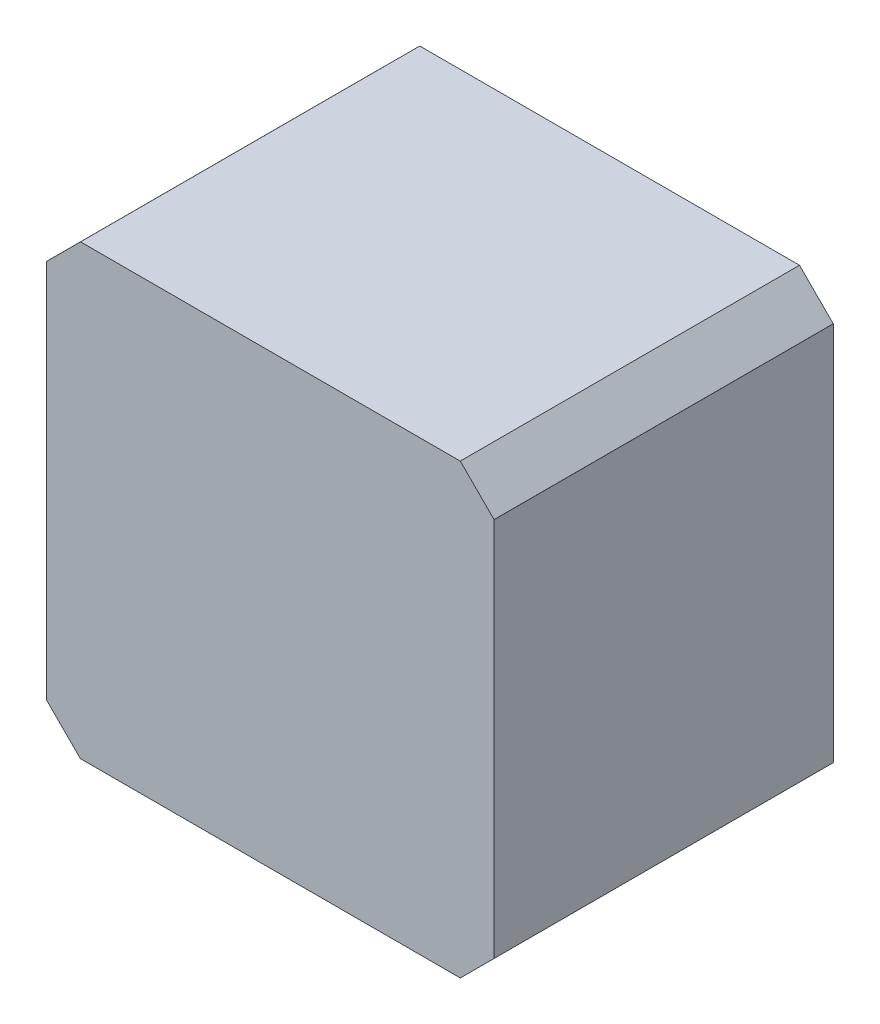
ISO-10303-21;
HEADER;
FILE_DESCRIPTION(('STEP AP214'),'2;1');
FILE_NAME('part.step','',(''),(''),'','','');
FILE_SCHEMA(('AUTOMOTIVE_DESIGN { 1 0 10303 214 1 1 1 1 }'));
ENDSEC;
DATA;
#1=APPLICATION_CONTEXT('core data for automotive mechanical design processes');
#2=APPLICATION_PROTOCOL_DEFINITION('international standard','automotive_design',2000,#1);
#3=PRODUCT_CONTEXT('',#1,'mechanical');
#4=PRODUCT('Part','Part','',(#3));
#5=PRODUCT_RELATED_PRODUCT_CATEGORY('part','',(#4));
#6=PRODUCT_DEFINITION_FORMATION('','',#4);
#7=PRODUCT_DEFINITION_CONTEXT('part definition',#1,'design');
#8=PRODUCT_DEFINITION('design','',#6,#7);
#9=PRODUCT_DEFINITION_SHAPE('','',#8);
#10=(LENGTH_UNIT() NAMED_UNIT(*) SI_UNIT(.MILLI.,.METRE.));
#11=(NAMED_UNIT(*) PLANE_ANGLE_UNIT() SI_UNIT($,.RADIAN.));
#12=(NAMED_UNIT(*) SI_UNIT($,.STERADIAN.) SOLID_ANGLE_UNIT());
#13=UNCERTAINTY_MEASURE_WITH_UNIT(LENGTH_MEASURE(1.E-05),#10,'distance_accuracy_value','');
#14=(GEOMETRIC_REPRESENTATION_CONTEXT(3) GLOBAL_UNCERTAINTY_ASSIGNED_CONTEXT((#13)) GLOBAL_UNIT_ASSIGNED_CONTEXT((#10,
#11,#12)) REPRESENTATION_CONTEXT('',''));
#15=CARTESIAN_POINT('',(0.,0.,0.));
#16=DIRECTION('',(0.,0.,1.));
#17=DIRECTION('',(1.,0.,0.));
#18=AXIS2_PLACEMENT_3D('',#15,#16,#17);
#19=CARTESIAN_POINT('',(21.94100454082,20.29168773,5.00000016));
#20=DIRECTION('',(0.,0.,1.));
#21=DIRECTION('',(1.,0.,0.));
#22=AXIS2_PLACEMENT_3D('',#19,#20,#21);
#23=PLANE('',#22);
#24=DIRECTION('',(-0.707106781186548,-0.707106781186548,0.));
#25=VECTOR('',#24,1.);
#26=CARTESIAN_POINT('',(21.94100454082,20.29168773,5.00000016));
#27=LINE('',#26,#25);
#28=CARTESIAN_POINT('',(21.94100454082,20.29168773,5.00000016));
#29=VERTEX_POINT('',#28);
#30=CARTESIAN_POINT('',(21.44296134082,19.79364453,5.00000016));
#31=VERTEX_POINT('',#30);
#32=EDGE_CURVE('E146',#29,#31,#27,.T.);
#33=ORIENTED_EDGE('',*,*,#32,.T.);
#34=DIRECTION('',(-0.999996307912623,0.00271738129860098,0.));
#35=VECTOR('',#34,1.);
#36=CARTESIAN_POINT('',(21.44296134082,19.79364453,5.00000016));
#37=LINE('',#36,#35);
#38=CARTESIAN_POINT('',(21.44202662082,19.79364707,5.00000016));
#39=VERTEX_POINT('',#38);
#40=EDGE_CURVE('E141',#31,#39,#37,.T.);
#41=ORIENTED_EDGE('',*,*,#40,.T.);
#42=DIRECTION('',(4.53280189256953E-07,-0.999999999999897,0.));
#43=VECTOR('',#42,1.);
#44=CARTESIAN_POINT('',(21.44202662082,19.79364707,5.00000016));
#45=LINE('',#44,#43);
#46=CARTESIAN_POINT('',(21.44202916082,14.19004893,5.00000016));
#47=VERTEX_POINT('',#46);
#48=EDGE_CURVE('E193',#39,#47,#45,.T.);
#49=ORIENTED_EDGE('',*,*,#48,.T.);
#50=DIRECTION('',(0.70710858750274,-0.70710497486574,0.));
#51=VECTOR('',#50,1.);
#52=CARTESIAN_POINT('',(21.44202916082,14.19004893,5.00000016));
#53=LINE('',#52,#51);
#54=CARTESIAN_POINT('',(21.93918844082,13.69289219,5.00000016));
#55=VERTEX_POINT('',#54);
#56=EDGE_CURVE('E164',#47,#55,#53,.T.);
#57=ORIENTED_EDGE('',*,*,#56,.T.);
#58=DIRECTION('',(0.713228571161718,0.700931526811723,0.));
#59=VECTOR('',#58,1.);
#60=CARTESIAN_POINT('',(21.93918844082,13.69289219,5.00000016));
#61=LINE('',#60,#59);
#62=CARTESIAN_POINT('',(21.93977772082,13.69347131,5.00000016));
#63=VERTEX_POINT('',#62);
#64=EDGE_CURVE('E223',#55,#63,#61,.T.);
#65=ORIENTED_EDGE('',*,*,#64,.T.);
#66=DIRECTION('',(0.999999999999897,4.53611216003853E-07,0.));
#67=VECTOR('',#66,1.);
#68=CARTESIAN_POINT('',(21.93977772082,13.69347131,5.00000016));
#69=LINE('',#68,#67);
#70=CARTESIAN_POINT('',(27.53928646082,13.69347385,5.00000016));
#71=VERTEX_POINT('',#70);
#72=EDGE_CURVE('E169',#63,#71,#69,.T.);
#73=ORIENTED_EDGE('',*,*,#72,.T.);
#74=DIRECTION('',(0.707103175090353,0.707110387264353,0.));
#75=VECTOR('',#74,1.);
#76=CARTESIAN_POINT('',(27.53928646082,13.69347385,5.00000016));
#77=LINE('',#76,#75);
#78=CARTESIAN_POINT('',(28.03734490082,14.19153737,5.00000016));
#79=VERTEX_POINT('',#78);
#80=EDGE_CURVE('E175',#71,#79,#77,.T.);
#81=ORIENTED_EDGE('',*,*,#80,.T.);
#82=DIRECTION('',(0.,1.,0.));
#83=VECTOR('',#82,1.);
#84=CARTESIAN_POINT('',(28.03734490082,14.19153737,5.00000016));
#85=LINE('',#84,#83);
#86=CARTESIAN_POINT('',(28.03734490082,19.79365469,5.00000016));
#87=VERTEX_POINT('',#86);
#88=EDGE_CURVE('E245',#79,#87,#85,.T.);
#89=ORIENTED_EDGE('',*,*,#88,.T.);
#90=DIRECTION('',(-1.,0.,0.));
#91=VECTOR('',#90,1.);
#92=CARTESIAN_POINT('',(28.03734490082,19.79365469,5.00000016));
#93=LINE('',#92,#91);
#94=CARTESIAN_POINT('',(28.03641018082,19.79365469,5.00000016));
#95=VERTEX_POINT('',#94);
#96=EDGE_CURVE('E189',#87,#95,#93,.T.);
#97=ORIENTED_EDGE('',*,*,#96,.T.);
#98=DIRECTION('',(-0.707106781186548,0.707106781186548,0.));
#99=VECTOR('',#98,1.);
#100=CARTESIAN_POINT('',(28.03641018082,19.79365469,5.00000016));
#101=LINE('',#100,#99);
#102=CARTESIAN_POINT('',(27.53836698082,20.29169789,5.00000016));
#103=VERTEX_POINT('',#102);
#104=EDGE_CURVE('E20',#95,#103,#101,.T.);
#105=ORIENTED_EDGE('',*,*,#104,.T.);
#106=DIRECTION('',(-0.999999999998353,-1.81514063041164E-06,0.));
#107=VECTOR('',#106,1.);
#108=CARTESIAN_POINT('',(27.53836698082,20.29169789,5.00000016));
#109=LINE('',#108,#107);
#110=EDGE_CURVE('E11',#103,#29,#109,.T.);
#111=ORIENTED_EDGE('',*,*,#110,.T.);
#112=EDGE_LOOP('',(#33,#41,#49,#57,#65,#73,#81,#89,#97,#105,#111));
#113=FACE_BOUND('',#112,.T.);
#114=ADVANCED_FACE('F16',(#113),#23,.T.);
#115=CARTESIAN_POINT('',(21.94100454082,20.29168773,0.));
#116=DIRECTION('',(0.,0.,1.));
#117=DIRECTION('',(1.,0.,0.));
#118=AXIS2_PLACEMENT_3D('',#115,#116,#117);
#119=PLANE('',#118);
#120=DIRECTION('',(-0.999999999998353,-1.81514063041164E-06,0.));
#121=VECTOR('',#120,1.);
#122=CARTESIAN_POINT('',(27.53836698082,20.29169789,0.));
#123=LINE('',#122,#121);
#124=CARTESIAN_POINT('',(27.53836698082,20.29169789,0.));
#125=VERTEX_POINT('',#124);
#126=CARTESIAN_POINT('',(21.94100454082,20.29168773,0.));
#127=VERTEX_POINT('',#126);
#128=EDGE_CURVE('E27',#125,#127,#123,.T.);
#129=ORIENTED_EDGE('',*,*,#128,.F.);
#130=DIRECTION('',(-0.707106781186548,0.707106781186548,0.));
#131=VECTOR('',#130,1.);
#132=CARTESIAN_POINT('',(28.03641018082,19.79365469,0.));
#133=LINE('',#132,#131);
#134=CARTESIAN_POINT('',(28.03641018082,19.79365469,0.));
#135=VERTEX_POINT('',#134);
#136=EDGE_CURVE('E204',#135,#125,#133,.T.);
#137=ORIENTED_EDGE('',*,*,#136,.F.);
#138=DIRECTION('',(-1.,0.,0.));
#139=VECTOR('',#138,1.);
#140=CARTESIAN_POINT('',(28.03734490082,19.79365469,0.));
#141=LINE('',#140,#139);
#142=CARTESIAN_POINT('',(28.03734490082,19.79365469,0.));
#143=VERTEX_POINT('',#142);
#144=EDGE_CURVE('E190',#143,#135,#141,.T.);
#145=ORIENTED_EDGE('',*,*,#144,.F.);
#146=DIRECTION('',(0.,1.,0.));
#147=VECTOR('',#146,1.);
#148=CARTESIAN_POINT('',(28.03734490082,14.19153737,0.));
#149=LINE('',#148,#147);
#150=CARTESIAN_POINT('',(28.03734490082,14.19153737,0.));
#151=VERTEX_POINT('',#150);
#152=EDGE_CURVE('E179',#151,#143,#149,.T.);
#153=ORIENTED_EDGE('',*,*,#152,.F.);
#154=DIRECTION('',(0.707103175090353,0.707110387264353,0.));
#155=VECTOR('',#154,1.);
#156=CARTESIAN_POINT('',(27.53928646082,13.69347385,0.));
#157=LINE('',#156,#155);
#158=CARTESIAN_POINT('',(27.53928646082,13.69347385,0.));
#159=VERTEX_POINT('',#158);
#160=EDGE_CURVE('E170',#159,#151,#157,.T.);
#161=ORIENTED_EDGE('',*,*,#160,.F.);
#162=DIRECTION('',(0.999999999999897,4.53611216003853E-07,0.));
#163=VECTOR('',#162,1.);
#164=CARTESIAN_POINT('',(21.93977772082,13.69347131,0.));
#165=LINE('',#164,#163);
#166=CARTESIAN_POINT('',(21.93977772082,13.69347131,0.));
#167=VERTEX_POINT('',#166);
#168=EDGE_CURVE('E157',#167,#159,#165,.T.);
#169=ORIENTED_EDGE('',*,*,#168,.F.);
#170=DIRECTION('',(0.713228571161718,0.700931526811723,0.));
#171=VECTOR('',#170,1.);
#172=CARTESIAN_POINT('',(21.93918844082,13.69289219,0.));
#173=LINE('',#172,#171);
#174=CARTESIAN_POINT('',(21.93918844082,13.69289219,0.));
#175=VERTEX_POINT('',#174);
#176=EDGE_CURVE('E159',#175,#167,#173,.T.);
#177=ORIENTED_EDGE('',*,*,#176,.F.);
#178=DIRECTION('',(0.70710858750274,-0.70710497486574,0.));
#179=VECTOR('',#178,1.);
#180=CARTESIAN_POINT('',(21.44202916082,14.19004893,0.));
#181=LINE('',#180,#179);
#182=CARTESIAN_POINT('',(21.44202916082,14.19004893,0.));
#183=VERTEX_POINT('',#182);
#184=EDGE_CURVE('E197',#183,#175,#181,.T.);
#185=ORIENTED_EDGE('',*,*,#184,.F.);
#186=DIRECTION('',(4.53280189256953E-07,-0.999999999999897,0.));
#187=VECTOR('',#186,1.);
#188=CARTESIAN_POINT('',(21.44202662082,19.79364707,0.));
#189=LINE('',#188,#187);
#190=CARTESIAN_POINT('',(21.44202662082,19.79364707,0.));
#191=VERTEX_POINT('',#190);
#192=EDGE_CURVE('E129',#191,#183,#189,.T.);
#193=ORIENTED_EDGE('',*,*,#192,.F.);
#194=DIRECTION('',(-0.999996307912623,0.00271738129860098,0.));
#195=VECTOR('',#194,1.);
#196=CARTESIAN_POINT('',(21.44296134082,19.79364453,0.));
#197=LINE('',#196,#195);
#198=CARTESIAN_POINT('',(21.44296134082,19.79364453,0.));
#199=VERTEX_POINT('',#198);
#200=EDGE_CURVE('E123',#199,#191,#197,.T.);
#201=ORIENTED_EDGE('',*,*,#200,.F.);
#202=DIRECTION('',(-0.707106781186548,-0.707106781186548,0.));
#203=VECTOR('',#202,1.);
#204=CARTESIAN_POINT('',(21.94100454082,20.29168773,0.));
#205=LINE('',#204,#203);
#206=EDGE_CURVE('E127',#127,#199,#205,.T.);
#207=ORIENTED_EDGE('',*,*,#206,.F.);
#208=EDGE_LOOP('',(#129,#137,#145,#153,#161,#169,#177,#185,#193,#201,#207));
#209=FACE_BOUND('',#208,.T.);
#210=ADVANCED_FACE('F125',(#209),#119,.F.);
#211=CARTESIAN_POINT('',(27.53836698082,20.29169789,0.));
#212=DIRECTION('',(1.81514063041164E-06,-0.999999999998353,0.));
#213=DIRECTION('',(0.,0.,-1.));
#214=AXIS2_PLACEMENT_3D('',#211,#212,#213);
#215=PLANE('',#214);
#216=ORIENTED_EDGE('',*,*,#128,.T.);
#217=DIRECTION('',(0.,0.,1.));
#218=VECTOR('',#217,1.);
#219=CARTESIAN_POINT('',(21.94100454082,20.29168773,0.));
#220=LINE('',#219,#218);
#221=EDGE_CURVE('E135',#127,#29,#220,.T.);
#222=ORIENTED_EDGE('',*,*,#221,.T.);
#223=ORIENTED_EDGE('',*,*,#110,.F.);
#224=DIRECTION('',(0.,0.,1.));
#225=VECTOR('',#224,1.);
#226=CARTESIAN_POINT('',(27.53836698082,20.29169789,0.));
#227=LINE('',#226,#225);
#228=EDGE_CURVE('E211',#125,#103,#227,.T.);
#229=ORIENTED_EDGE('',*,*,#228,.F.);
#230=EDGE_LOOP('',(#216,#222,#223,#229));
#231=FACE_BOUND('',#230,.T.);
#232=ADVANCED_FACE('F321',(#231),#215,.F.);
#233=CARTESIAN_POINT('',(28.03641018082,19.79365469,0.));
#234=DIRECTION('',(-0.707106781186548,-0.707106781186548,0.));
#235=DIRECTION('',(-0.707106781186548,0.707106781186548,0.));
#236=AXIS2_PLACEMENT_3D('',#233,#234,#235);
#237=PLANE('',#236);
#238=ORIENTED_EDGE('',*,*,#136,.T.);
#239=ORIENTED_EDGE('',*,*,#228,.T.);
#240=ORIENTED_EDGE('',*,*,#104,.F.);
#241=DIRECTION('',(0.,0.,1.));
#242=VECTOR('',#241,1.);
#243=CARTESIAN_POINT('',(28.03641018082,19.79365469,0.));
#244=LINE('',#243,#242);
#245=EDGE_CURVE('E185',#135,#95,#244,.T.);
#246=ORIENTED_EDGE('',*,*,#245,.F.);
#247=EDGE_LOOP('',(#238,#239,#240,#246));
#248=FACE_BOUND('',#247,.T.);
#249=ADVANCED_FACE('F325',(#248),#237,.F.);
#250=CARTESIAN_POINT('',(28.03734490082,19.79365469,0.));
#251=DIRECTION('',(0.,-1.,0.));
#252=DIRECTION('',(0.,0.,-1.));
#253=AXIS2_PLACEMENT_3D('',#250,#251,#252);
#254=PLANE('',#253);
#255=ORIENTED_EDGE('',*,*,#144,.T.);
#256=ORIENTED_EDGE('',*,*,#245,.T.);
#257=ORIENTED_EDGE('',*,*,#96,.F.);
#258=DIRECTION('',(0.,0.,1.));
#259=VECTOR('',#258,1.);
#260=CARTESIAN_POINT('',(28.03734490082,19.79365469,0.));
#261=LINE('',#260,#259);
#262=EDGE_CURVE('E235',#143,#87,#261,.T.);
#263=ORIENTED_EDGE('',*,*,#262,.F.);
#264=EDGE_LOOP('',(#255,#256,#257,#263));
#265=FACE_BOUND('',#264,.T.);
#266=ADVANCED_FACE('F18',(#265),#254,.F.);
#267=CARTESIAN_POINT('',(28.03734490082,14.19153737,0.));
#268=DIRECTION('',(-1.,0.,0.));
#269=DIRECTION('',(0.,0.,1.));
#270=AXIS2_PLACEMENT_3D('',#267,#268,#269);
#271=PLANE('',#270);
#272=ORIENTED_EDGE('',*,*,#152,.T.);
#273=ORIENTED_EDGE('',*,*,#262,.T.);
#274=ORIENTED_EDGE('',*,*,#88,.F.);
#275=DIRECTION('',(0.,0.,1.));
#276=VECTOR('',#275,1.);
#277=CARTESIAN_POINT('',(28.03734490082,14.19153737,0.));
#278=LINE('',#277,#276);
#279=EDGE_CURVE('E174',#151,#79,#278,.T.);
#280=ORIENTED_EDGE('',*,*,#279,.F.);
#281=EDGE_LOOP('',(#272,#273,#274,#280));
#282=FACE_BOUND('',#281,.T.);
#283=ADVANCED_FACE('F328',(#282),#271,.F.);
#284=CARTESIAN_POINT('',(27.53928646082,13.69347385,0.));
#285=DIRECTION('',(-0.707110387264353,0.707103175090353,0.));
#286=DIRECTION('',(0.,0.,1.));
#287=AXIS2_PLACEMENT_3D('',#284,#285,#286);
#288=PLANE('',#287);
#289=ORIENTED_EDGE('',*,*,#160,.T.);
#290=ORIENTED_EDGE('',*,*,#279,.T.);
#291=ORIENTED_EDGE('',*,*,#80,.F.);
#292=DIRECTION('',(0.,0.,1.));
#293=VECTOR('',#292,1.);
#294=CARTESIAN_POINT('',(27.53928646082,13.69347385,0.));
#295=LINE('',#294,#293);
#296=EDGE_CURVE('E165',#159,#71,#295,.T.);
#297=ORIENTED_EDGE('',*,*,#296,.F.);
#298=EDGE_LOOP('',(#289,#290,#291,#297));
#299=FACE_BOUND('',#298,.T.);
#300=ADVANCED_FACE('F330',(#299),#288,.F.);
#301=CARTESIAN_POINT('',(21.93977772082,13.69347131,0.));
#302=DIRECTION('',(-4.53611216003853E-07,0.999999999999897,0.));
#303=DIRECTION('',(0.,0.,1.));
#304=AXIS2_PLACEMENT_3D('',#301,#302,#303);
#305=PLANE('',#304);
#306=ORIENTED_EDGE('',*,*,#168,.T.);
#307=ORIENTED_EDGE('',*,*,#296,.T.);
#308=ORIENTED_EDGE('',*,*,#72,.F.);
#309=DIRECTION('',(0.,0.,1.));
#310=VECTOR('',#309,1.);
#311=CARTESIAN_POINT('',(21.93977772082,13.69347131,0.));
#312=LINE('',#311,#310);
#313=EDGE_CURVE('E163',#167,#63,#312,.T.);
#314=ORIENTED_EDGE('',*,*,#313,.F.);
#315=EDGE_LOOP('',(#306,#307,#308,#314));
#316=FACE_BOUND('',#315,.T.);
#317=ADVANCED_FACE('F336',(#316),#305,.F.);
#318=CARTESIAN_POINT('',(21.93918844082,13.69289219,0.));
#319=DIRECTION('',(-0.700931526811723,0.713228571161718,0.));
#320=DIRECTION('',(0.,0.,1.));
#321=AXIS2_PLACEMENT_3D('',#318,#319,#320);
#322=PLANE('',#321);
#323=ORIENTED_EDGE('',*,*,#176,.T.);
#324=ORIENTED_EDGE('',*,*,#313,.T.);
#325=ORIENTED_EDGE('',*,*,#64,.F.);
#326=DIRECTION('',(0.,0.,1.));
#327=VECTOR('',#326,1.);
#328=CARTESIAN_POINT('',(21.93918844082,13.69289219,0.));
#329=LINE('',#328,#327);
#330=EDGE_CURVE('E229',#175,#55,#329,.T.);
#331=ORIENTED_EDGE('',*,*,#330,.F.);
#332=EDGE_LOOP('',(#323,#324,#325,#331));
#333=FACE_BOUND('',#332,.T.);
#334=ADVANCED_FACE('F266',(#333),#322,.F.);
#335=CARTESIAN_POINT('',(21.44202916082,14.19004893,0.));
#336=DIRECTION('',(0.70710497486574,0.70710858750274,0.));
#337=DIRECTION('',(0.,0.,-1.));
#338=AXIS2_PLACEMENT_3D('',#335,#336,#337);
#339=PLANE('',#338);
#340=ORIENTED_EDGE('',*,*,#184,.T.);
#341=ORIENTED_EDGE('',*,*,#330,.T.);
#342=ORIENTED_EDGE('',*,*,#56,.F.);
#343=DIRECTION('',(0.,0.,1.));
#344=VECTOR('',#343,1.);
#345=CARTESIAN_POINT('',(21.44202916082,14.19004893,0.));
#346=LINE('',#345,#344);
#347=EDGE_CURVE('E182',#183,#47,#346,.T.);
#348=ORIENTED_EDGE('',*,*,#347,.F.);
#349=EDGE_LOOP('',(#340,#341,#342,#348));
#350=FACE_BOUND('',#349,.T.);
#351=ADVANCED_FACE('F263',(#350),#339,.F.);
#352=CARTESIAN_POINT('',(21.44202662082,19.79364707,0.));
#353=DIRECTION('',(0.999999999999897,4.53280189256953E-07,0.));
#354=DIRECTION('',(0.,0.,-1.));
#355=AXIS2_PLACEMENT_3D('',#352,#353,#354);
#356=PLANE('',#355);
#357=ORIENTED_EDGE('',*,*,#192,.T.);
#358=ORIENTED_EDGE('',*,*,#347,.T.);
#359=ORIENTED_EDGE('',*,*,#48,.F.);
#360=DIRECTION('',(0.,0.,1.));
#361=VECTOR('',#360,1.);
#362=CARTESIAN_POINT('',(21.44202662082,19.79364707,0.));
#363=LINE('',#362,#361);
#364=EDGE_CURVE('E134',#191,#39,#363,.T.);
#365=ORIENTED_EDGE('',*,*,#364,.F.);
#366=EDGE_LOOP('',(#357,#358,#359,#365));
#367=FACE_BOUND('',#366,.T.);
#368=ADVANCED_FACE('F269',(#367),#356,.F.);
#369=CARTESIAN_POINT('',(21.44296134082,19.79364453,0.));
#370=DIRECTION('',(-0.00271738129860098,-0.999996307912623,0.));
#371=DIRECTION('',(-0.999996307912623,0.00271738129860098,0.));
#372=AXIS2_PLACEMENT_3D('',#369,#370,#371);
#373=PLANE('',#372);
#374=ORIENTED_EDGE('',*,*,#200,.T.);
#375=ORIENTED_EDGE('',*,*,#364,.T.);
#376=ORIENTED_EDGE('',*,*,#40,.F.);
#377=DIRECTION('',(0.,0.,1.));
#378=VECTOR('',#377,1.);
#379=CARTESIAN_POINT('',(21.44296134082,19.79364453,0.));
#380=LINE('',#379,#378);
#381=EDGE_CURVE('E138',#199,#31,#380,.T.);
#382=ORIENTED_EDGE('',*,*,#381,.F.);
#383=EDGE_LOOP('',(#374,#375,#376,#382));
#384=FACE_BOUND('',#383,.T.);
#385=ADVANCED_FACE('F139',(#384),#373,.F.);
#386=CARTESIAN_POINT('',(21.94100454082,20.29168773,0.));
#387=DIRECTION('',(0.707106781186548,-0.707106781186548,0.));
#388=DIRECTION('',(0.,0.,-1.));
#389=AXIS2_PLACEMENT_3D('',#386,#387,#388);
#390=PLANE('',#389);
#391=ORIENTED_EDGE('',*,*,#206,.T.);
#392=ORIENTED_EDGE('',*,*,#381,.T.);
#393=ORIENTED_EDGE('',*,*,#32,.F.);
#394=ORIENTED_EDGE('',*,*,#221,.F.);
#395=EDGE_LOOP('',(#391,#392,#393,#394));
#396=FACE_BOUND('',#395,.T.);
#397=ADVANCED_FACE('F149',(#396),#390,.F.);
#398=CLOSED_SHELL('',(#114,#210,#232,#249,#266,#283,#300,#317,#334,#351,#368,#385,#397));
#399=MANIFOLD_SOLID_BREP('B1',#398);
#400=ADVANCED_BREP_SHAPE_REPRESENTATION('',(#18,#399),#14);
#401=SHAPE_DEFINITION_REPRESENTATION(#9,#400);
ENDSEC;
END-ISO-10303-21;
